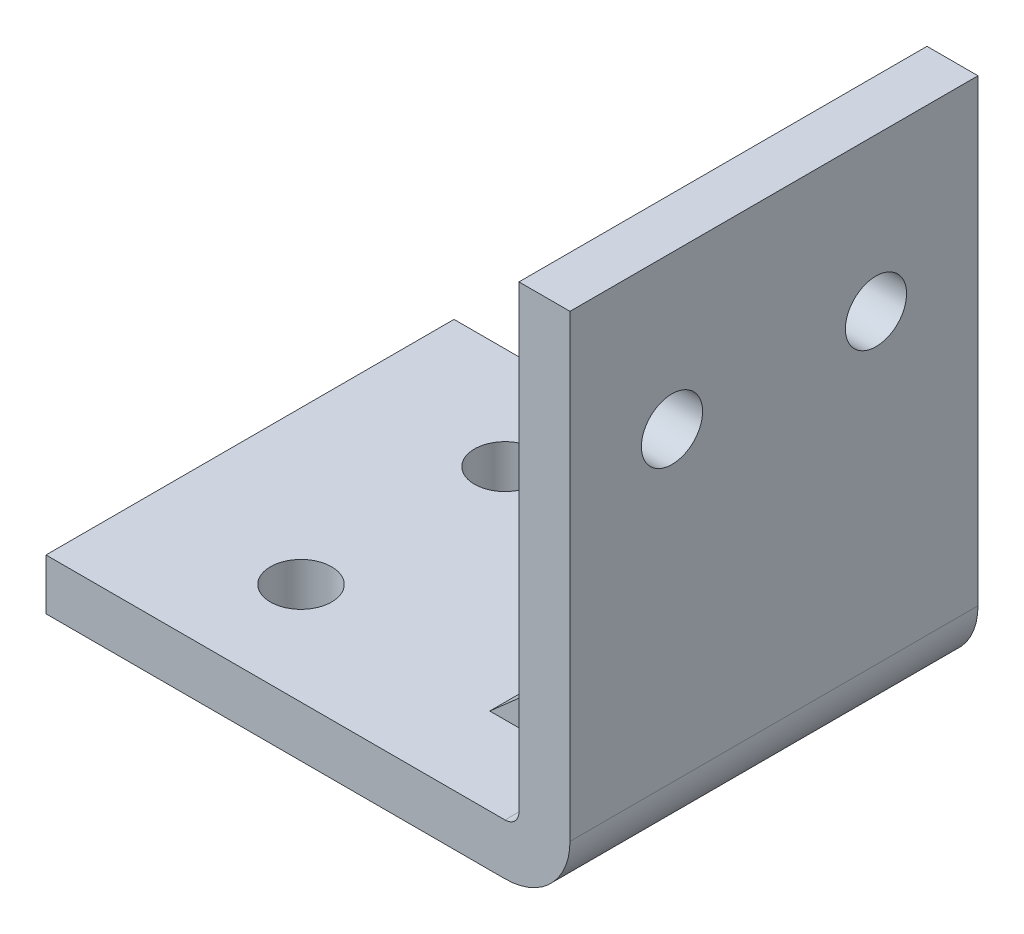
ISO-10303-21;
HEADER;
FILE_DESCRIPTION(('STEP AP214'),'2;1');
FILE_NAME('part.step','',(''),(''),'','','');
FILE_SCHEMA(('AUTOMOTIVE_DESIGN { 1 0 10303 214 1 1 1 1 }'));
ENDSEC;
DATA;
#1=APPLICATION_CONTEXT('core data for automotive mechanical design processes');
#2=APPLICATION_PROTOCOL_DEFINITION('international standard','automotive_design',2000,#1);
#3=PRODUCT_CONTEXT('',#1,'mechanical');
#4=PRODUCT('Part','Part','',(#3));
#5=PRODUCT_RELATED_PRODUCT_CATEGORY('part','',(#4));
#6=PRODUCT_DEFINITION_FORMATION('','',#4);
#7=PRODUCT_DEFINITION_CONTEXT('part definition',#1,'design');
#8=PRODUCT_DEFINITION('design','',#6,#7);
#9=PRODUCT_DEFINITION_SHAPE('','',#8);
#10=(LENGTH_UNIT() NAMED_UNIT(*) SI_UNIT(.MILLI.,.METRE.));
#11=(NAMED_UNIT(*) PLANE_ANGLE_UNIT() SI_UNIT($,.RADIAN.));
#12=(NAMED_UNIT(*) SI_UNIT($,.STERADIAN.) SOLID_ANGLE_UNIT());
#13=UNCERTAINTY_MEASURE_WITH_UNIT(LENGTH_MEASURE(1.E-05),#10,'distance_accuracy_value','');
#14=(GEOMETRIC_REPRESENTATION_CONTEXT(3) GLOBAL_UNCERTAINTY_ASSIGNED_CONTEXT((#13)) GLOBAL_UNIT_ASSIGNED_CONTEXT((#10,
#11,#12)) REPRESENTATION_CONTEXT('',''));
#15=CARTESIAN_POINT('',(0.,0.,0.));
#16=DIRECTION('',(0.,0.,1.));
#17=DIRECTION('',(1.,0.,0.));
#18=AXIS2_PLACEMENT_3D('',#15,#16,#17);
#19=CARTESIAN_POINT('',(-5.,6.3661977236758,20.0000000004366));
#20=DIRECTION('',(0.,0.,-1.));
#21=DIRECTION('',(1.,0.,0.));
#22=AXIS2_PLACEMENT_3D('',#19,#20,#21);
#23=CYLINDRICAL_SURFACE('',#22,1.3661977236758);
#24=CARTESIAN_POINT('',(-5.,6.3661977236758,-8.5));
#25=DIRECTION('',(0.,0.,-1.));
#26=DIRECTION('',(-1.,0.,0.));
#27=AXIS2_PLACEMENT_3D('',#24,#25,#26);
#28=CIRCLE('',#27,1.3661977236758);
#29=CARTESIAN_POINT('',(-5.00000000000003,5.,-8.5));
#30=VERTEX_POINT('',#29);
#31=CARTESIAN_POINT('',(-3.63380227632419,6.3661977236758,-8.5));
#32=VERTEX_POINT('',#31);
#33=EDGE_CURVE('E115',#30,#32,#28,.F.);
#34=ORIENTED_EDGE('',*,*,#33,.F.);
#35=DIRECTION('',(0.,0.,-1.));
#36=VECTOR('',#35,1.);
#37=CARTESIAN_POINT('',(-5.00000000000003,5.,0.));
#38=LINE('',#37,#36);
#39=CARTESIAN_POINT('',(-5.00000000000002,5.,8.5));
#40=VERTEX_POINT('',#39);
#41=EDGE_CURVE('E282',#40,#30,#38,.T.);
#42=ORIENTED_EDGE('',*,*,#41,.F.);
#43=CARTESIAN_POINT('',(-5.,6.3661977236758,8.5));
#44=DIRECTION('',(0.,0.,1.));
#45=DIRECTION('',(1.,0.,0.));
#46=AXIS2_PLACEMENT_3D('',#43,#44,#45);
#47=CIRCLE('',#46,1.3661977236758);
#48=CARTESIAN_POINT('',(-3.63380227632419,6.3661977236758,8.5));
#49=VERTEX_POINT('',#48);
#50=EDGE_CURVE('E249',#49,#40,#47,.F.);
#51=ORIENTED_EDGE('',*,*,#50,.F.);
#52=DIRECTION('',(0.,0.,-1.));
#53=VECTOR('',#52,1.);
#54=CARTESIAN_POINT('',(-3.63380227632419,6.3661977236758,0.));
#55=LINE('',#54,#53);
#56=EDGE_CURVE('E270',#49,#32,#55,.T.);
#57=ORIENTED_EDGE('',*,*,#56,.T.);
#58=EDGE_LOOP('',(#34,#42,#51,#57));
#59=FACE_BOUND('',#58,.T.);
#60=ADVANCED_FACE('F98',(#59),#23,.F.);
#61=CARTESIAN_POINT('',(-5.00000000000003,5.,-11.5));
#62=VERTEX_POINT('',#61);
#63=CARTESIAN_POINT('',(-5.00000000000002,5.,-20.));
#64=VERTEX_POINT('',#63);
#65=EDGE_CURVE('E283',#62,#64,#38,.T.);
#66=ORIENTED_EDGE('',*,*,#65,.F.);
#67=CARTESIAN_POINT('',(-5.,6.3661977236758,-11.5));
#68=DIRECTION('',(0.,0.,-1.));
#69=DIRECTION('',(-1.,0.,0.));
#70=AXIS2_PLACEMENT_3D('',#67,#68,#69);
#71=CIRCLE('',#70,1.3661977236758);
#72=CARTESIAN_POINT('',(-3.63380227632419,6.3661977236758,-11.5));
#73=VERTEX_POINT('',#72);
#74=EDGE_CURVE('E238',#62,#73,#71,.F.);
#75=ORIENTED_EDGE('',*,*,#74,.T.);
#76=CARTESIAN_POINT('',(-3.63380227632419,6.3661977236758,-20.));
#77=VERTEX_POINT('',#76);
#78=EDGE_CURVE('E271',#73,#77,#55,.T.);
#79=ORIENTED_EDGE('',*,*,#78,.T.);
#80=CARTESIAN_POINT('',(-5.,6.3661977236758,-20.));
#81=DIRECTION('',(0.,0.,-1.));
#82=DIRECTION('',(-1.,0.,0.));
#83=AXIS2_PLACEMENT_3D('',#80,#81,#82);
#84=CIRCLE('',#83,1.3661977236758);
#85=EDGE_CURVE('E341',#77,#64,#84,.T.);
#86=ORIENTED_EDGE('',*,*,#85,.T.);
#87=EDGE_LOOP('',(#66,#75,#79,#86));
#88=FACE_BOUND('',#87,.T.);
#89=ADVANCED_FACE('F424',(#88),#23,.F.);
#90=CARTESIAN_POINT('',(1.36619772367586,36.3661977236759,10.));
#91=DIRECTION('',(-1.,0.,0.));
#92=DIRECTION('',(0.,0.,1.));
#93=AXIS2_PLACEMENT_3D('',#90,#91,#92);
#94=CYLINDRICAL_SURFACE('',#93,3.);
#95=CARTESIAN_POINT('',(-3.63380227632414,36.3661977236759,10.));
#96=DIRECTION('',(-1.,0.,0.));
#97=DIRECTION('',(0.,0.,-1.));
#98=AXIS2_PLACEMENT_3D('',#95,#96,#97);
#99=CIRCLE('',#98,3.);
#100=CARTESIAN_POINT('',(-3.63380227632414,36.3661977236759,7.));
#101=VERTEX_POINT('',#100);
#102=EDGE_CURVE('E265',#101,#101,#99,.T.);
#103=ORIENTED_EDGE('',*,*,#102,.T.);
#104=EDGE_LOOP('',(#103));
#105=FACE_BOUND('',#104,.T.);
#106=CARTESIAN_POINT('',(1.36619772367586,36.3661977236759,10.));
#107=DIRECTION('',(-1.,0.,0.));
#108=DIRECTION('',(0.,0.,-1.));
#109=AXIS2_PLACEMENT_3D('',#106,#107,#108);
#110=CIRCLE('',#109,3.);
#111=CARTESIAN_POINT('',(1.36619772367586,36.3661977236759,7.));
#112=VERTEX_POINT('',#111);
#113=EDGE_CURVE('E274',#112,#112,#110,.T.);
#114=ORIENTED_EDGE('',*,*,#113,.F.);
#115=EDGE_LOOP('',(#114));
#116=FACE_BOUND('',#115,.T.);
#117=ADVANCED_FACE('F453',(#105,#116),#94,.F.);
#118=CARTESIAN_POINT('',(-35.,0.,10.));
#119=DIRECTION('',(0.,1.,0.));
#120=DIRECTION('',(0.,0.,1.));
#121=AXIS2_PLACEMENT_3D('',#118,#119,#120);
#122=CYLINDRICAL_SURFACE('',#121,3.);
#123=CARTESIAN_POINT('',(-35.,5.,10.));
#124=DIRECTION('',(0.,-1.,0.));
#125=DIRECTION('',(0.,0.,-1.));
#126=AXIS2_PLACEMENT_3D('',#123,#124,#125);
#127=CIRCLE('',#126,3.);
#128=CARTESIAN_POINT('',(-35.,5.,7.));
#129=VERTEX_POINT('',#128);
#130=EDGE_CURVE('E277',#129,#129,#127,.T.);
#131=ORIENTED_EDGE('',*,*,#130,.F.);
#132=EDGE_LOOP('',(#131));
#133=FACE_BOUND('',#132,.T.);
#134=CARTESIAN_POINT('',(-35.,0.,10.));
#135=DIRECTION('',(0.,-1.,0.));
#136=DIRECTION('',(0.,0.,-1.));
#137=AXIS2_PLACEMENT_3D('',#134,#135,#136);
#138=CIRCLE('',#137,3.);
#139=CARTESIAN_POINT('',(-35.,0.,7.));
#140=VERTEX_POINT('',#139);
#141=EDGE_CURVE('E13',#140,#140,#138,.T.);
#142=ORIENTED_EDGE('',*,*,#141,.T.);
#143=EDGE_LOOP('',(#142));
#144=FACE_BOUND('',#143,.T.);
#145=ADVANCED_FACE('F467',(#133,#144),#122,.F.);
#146=CARTESIAN_POINT('',(1.36619772367586,36.3661977236759,-10.));
#147=DIRECTION('',(-1.,0.,0.));
#148=DIRECTION('',(0.,0.,1.));
#149=AXIS2_PLACEMENT_3D('',#146,#147,#148);
#150=CYLINDRICAL_SURFACE('',#149,3.);
#151=CARTESIAN_POINT('',(-3.63380227632414,36.3661977236759,-10.));
#152=DIRECTION('',(1.,0.,0.));
#153=DIRECTION('',(0.,0.,1.));
#154=AXIS2_PLACEMENT_3D('',#151,#152,#153);
#155=CIRCLE('',#154,3.);
#156=CARTESIAN_POINT('',(-3.63380227632414,36.3661977236759,-7.));
#157=VERTEX_POINT('',#156);
#158=EDGE_CURVE('E311',#157,#157,#155,.T.);
#159=ORIENTED_EDGE('',*,*,#158,.F.);
#160=EDGE_LOOP('',(#159));
#161=FACE_BOUND('',#160,.T.);
#162=CARTESIAN_POINT('',(1.36619772367586,36.3661977236759,-10.));
#163=DIRECTION('',(1.,0.,0.));
#164=DIRECTION('',(0.,0.,1.));
#165=AXIS2_PLACEMENT_3D('',#162,#163,#164);
#166=CIRCLE('',#165,3.);
#167=CARTESIAN_POINT('',(1.36619772367586,36.3661977236759,-7.));
#168=VERTEX_POINT('',#167);
#169=EDGE_CURVE('E107',#168,#168,#166,.T.);
#170=ORIENTED_EDGE('',*,*,#169,.T.);
#171=EDGE_LOOP('',(#170));
#172=FACE_BOUND('',#171,.T.);
#173=ADVANCED_FACE('F462',(#161,#172),#150,.F.);
#174=CARTESIAN_POINT('',(-35.,0.,-10.));
#175=DIRECTION('',(0.,1.,0.));
#176=DIRECTION('',(0.,0.,1.));
#177=AXIS2_PLACEMENT_3D('',#174,#175,#176);
#178=CYLINDRICAL_SURFACE('',#177,3.);
#179=CARTESIAN_POINT('',(-35.,5.,-10.));
#180=DIRECTION('',(0.,1.,0.));
#181=DIRECTION('',(0.,0.,1.));
#182=AXIS2_PLACEMENT_3D('',#179,#180,#181);
#183=CIRCLE('',#182,3.);
#184=CARTESIAN_POINT('',(-35.,5.,-7.));
#185=VERTEX_POINT('',#184);
#186=EDGE_CURVE('E349',#185,#185,#183,.T.);
#187=ORIENTED_EDGE('',*,*,#186,.T.);
#188=EDGE_LOOP('',(#187));
#189=FACE_BOUND('',#188,.T.);
#190=CARTESIAN_POINT('',(-35.,0.,-10.));
#191=DIRECTION('',(0.,1.,0.));
#192=DIRECTION('',(0.,0.,1.));
#193=AXIS2_PLACEMENT_3D('',#190,#191,#192);
#194=CIRCLE('',#193,3.);
#195=CARTESIAN_POINT('',(-35.,0.,-7.));
#196=VERTEX_POINT('',#195);
#197=EDGE_CURVE('E346',#196,#196,#194,.T.);
#198=ORIENTED_EDGE('',*,*,#197,.F.);
#199=EDGE_LOOP('',(#198));
#200=FACE_BOUND('',#199,.T.);
#201=ADVANCED_FACE('F457',(#189,#200),#178,.F.);
#202=CARTESIAN_POINT('',(-3.63380227632419,6.3661977236758,20.));
#203=VERTEX_POINT('',#202);
#204=CARTESIAN_POINT('',(-3.6338022763242,6.3661977236758,11.5));
#205=VERTEX_POINT('',#204);
#206=EDGE_CURVE('E266',#203,#205,#55,.T.);
#207=ORIENTED_EDGE('',*,*,#206,.T.);
#208=CARTESIAN_POINT('',(-5.,6.3661977236758,11.5));
#209=DIRECTION('',(0.,0.,1.));
#210=DIRECTION('',(1.,0.,0.));
#211=AXIS2_PLACEMENT_3D('',#208,#209,#210);
#212=CIRCLE('',#211,1.3661977236758);
#213=CARTESIAN_POINT('',(-5.00000000000002,5.,11.5));
#214=VERTEX_POINT('',#213);
#215=EDGE_CURVE('E256',#205,#214,#212,.F.);
#216=ORIENTED_EDGE('',*,*,#215,.T.);
#217=CARTESIAN_POINT('',(-5.00000000000002,5.,20.));
#218=VERTEX_POINT('',#217);
#219=EDGE_CURVE('E278',#218,#214,#38,.T.);
#220=ORIENTED_EDGE('',*,*,#219,.F.);
#221=CARTESIAN_POINT('',(-5.,6.3661977236758,20.));
#222=DIRECTION('',(0.,0.,-1.));
#223=DIRECTION('',(-1.,0.,0.));
#224=AXIS2_PLACEMENT_3D('',#221,#222,#223);
#225=CIRCLE('',#224,1.3661977236758);
#226=EDGE_CURVE('E269',#218,#203,#225,.F.);
#227=ORIENTED_EDGE('',*,*,#226,.T.);
#228=EDGE_LOOP('',(#207,#216,#220,#227));
#229=FACE_BOUND('',#228,.T.);
#230=ADVANCED_FACE('F407',(#229),#23,.F.);
#231=CARTESIAN_POINT('',(-3.63380227632411,51.3661977236758,20.));
#232=DIRECTION('',(0.,0.,-1.));
#233=DIRECTION('',(0.,-1.,0.));
#234=AXIS2_PLACEMENT_3D('',#231,#232,#233);
#235=PLANE('',#234);
#236=DIRECTION('',(0.,1.,0.));
#237=VECTOR('',#236,1.);
#238=CARTESIAN_POINT('',(-3.63380227632411,51.3661977236758,20.));
#239=LINE('',#238,#237);
#240=CARTESIAN_POINT('',(-3.63380227632411,51.3661977236758,20.));
#241=VERTEX_POINT('',#240);
#242=EDGE_CURVE('E318',#203,#241,#239,.T.);
#243=ORIENTED_EDGE('',*,*,#242,.F.);
#244=ORIENTED_EDGE('',*,*,#226,.F.);
#245=DIRECTION('',(1.,0.,0.));
#246=VECTOR('',#245,1.);
#247=CARTESIAN_POINT('',(50.,5.,20.));
#248=LINE('',#247,#246);
#249=CARTESIAN_POINT('',(-50.,5.,20.));
#250=VERTEX_POINT('',#249);
#251=EDGE_CURVE('E281',#250,#218,#248,.T.);
#252=ORIENTED_EDGE('',*,*,#251,.F.);
#253=DIRECTION('',(0.,-1.,0.));
#254=VECTOR('',#253,1.);
#255=CARTESIAN_POINT('',(-50.,5.,20.));
#256=LINE('',#255,#254);
#257=CARTESIAN_POINT('',(-50.,0.,20.));
#258=VERTEX_POINT('',#257);
#259=EDGE_CURVE('E284',#250,#258,#256,.T.);
#260=ORIENTED_EDGE('',*,*,#259,.T.);
#261=DIRECTION('',(1.,0.,0.));
#262=VECTOR('',#261,1.);
#263=CARTESIAN_POINT('',(50.,0.,20.));
#264=LINE('',#263,#262);
#265=CARTESIAN_POINT('',(-5.00000000000002,0.,20.));
#266=VERTEX_POINT('',#265);
#267=EDGE_CURVE('E288',#258,#266,#264,.T.);
#268=ORIENTED_EDGE('',*,*,#267,.T.);
#269=CARTESIAN_POINT('',(-5.,6.3661977236758,20.));
#270=DIRECTION('',(0.,0.,-1.));
#271=DIRECTION('',(-1.,0.,0.));
#272=AXIS2_PLACEMENT_3D('',#269,#270,#271);
#273=CIRCLE('',#272,6.3661977236758);
#274=CARTESIAN_POINT('',(1.3661977236758,6.36619772367579,20.));
#275=VERTEX_POINT('',#274);
#276=EDGE_CURVE('E102',#266,#275,#273,.F.);
#277=ORIENTED_EDGE('',*,*,#276,.T.);
#278=DIRECTION('',(0.,1.,0.));
#279=VECTOR('',#278,1.);
#280=CARTESIAN_POINT('',(1.36619772367589,51.3661977236758,20.));
#281=LINE('',#280,#279);
#282=CARTESIAN_POINT('',(1.36619772367589,51.3661977236758,20.));
#283=VERTEX_POINT('',#282);
#284=EDGE_CURVE('E332',#275,#283,#281,.T.);
#285=ORIENTED_EDGE('',*,*,#284,.T.);
#286=DIRECTION('',(1.,0.,0.));
#287=VECTOR('',#286,1.);
#288=CARTESIAN_POINT('',(-3.63380227632411,51.3661977236758,20.));
#289=LINE('',#288,#287);
#290=EDGE_CURVE('E291',#241,#283,#289,.T.);
#291=ORIENTED_EDGE('',*,*,#290,.F.);
#292=EDGE_LOOP('',(#243,#244,#252,#260,#268,#277,#285,#291));
#293=FACE_BOUND('',#292,.T.);
#294=ADVANCED_FACE('F389',(#293),#235,.F.);
#295=CARTESIAN_POINT('',(-3.63380227632411,51.3661977236758,-20.));
#296=DIRECTION('',(0.,0.,1.));
#297=DIRECTION('',(0.,1.,0.));
#298=AXIS2_PLACEMENT_3D('',#295,#296,#297);
#299=PLANE('',#298);
#300=DIRECTION('',(0.,-1.,0.));
#301=VECTOR('',#300,1.);
#302=CARTESIAN_POINT('',(1.36619772367589,51.3661977236758,-20.));
#303=LINE('',#302,#301);
#304=CARTESIAN_POINT('',(1.36619772367589,51.3661977236758,-20.));
#305=VERTEX_POINT('',#304);
#306=CARTESIAN_POINT('',(1.36619772367581,6.36619772367579,-20.));
#307=VERTEX_POINT('',#306);
#308=EDGE_CURVE('E299',#305,#307,#303,.T.);
#309=ORIENTED_EDGE('',*,*,#308,.T.);
#310=CARTESIAN_POINT('',(-5.,6.3661977236758,-20.));
#311=DIRECTION('',(0.,0.,-1.));
#312=DIRECTION('',(-1.,0.,0.));
#313=AXIS2_PLACEMENT_3D('',#310,#311,#312);
#314=CIRCLE('',#313,6.3661977236758);
#315=CARTESIAN_POINT('',(-5.00000000000002,0.,-20.));
#316=VERTEX_POINT('',#315);
#317=EDGE_CURVE('E327',#307,#316,#314,.T.);
#318=ORIENTED_EDGE('',*,*,#317,.T.);
#319=DIRECTION('',(-1.,0.,0.));
#320=VECTOR('',#319,1.);
#321=CARTESIAN_POINT('',(50.,0.,-20.));
#322=LINE('',#321,#320);
#323=CARTESIAN_POINT('',(-50.,0.,-20.));
#324=VERTEX_POINT('',#323);
#325=EDGE_CURVE('E294',#316,#324,#322,.T.);
#326=ORIENTED_EDGE('',*,*,#325,.T.);
#327=DIRECTION('',(0.,-1.,0.));
#328=VECTOR('',#327,1.);
#329=CARTESIAN_POINT('',(-50.,5.,-20.));
#330=LINE('',#329,#328);
#331=CARTESIAN_POINT('',(-50.,5.,-20.));
#332=VERTEX_POINT('',#331);
#333=EDGE_CURVE('E287',#332,#324,#330,.T.);
#334=ORIENTED_EDGE('',*,*,#333,.F.);
#335=DIRECTION('',(-1.,0.,0.));
#336=VECTOR('',#335,1.);
#337=CARTESIAN_POINT('',(50.,5.,-20.));
#338=LINE('',#337,#336);
#339=EDGE_CURVE('E312',#64,#332,#338,.T.);
#340=ORIENTED_EDGE('',*,*,#339,.F.);
#341=ORIENTED_EDGE('',*,*,#85,.F.);
#342=DIRECTION('',(0.,-1.,0.));
#343=VECTOR('',#342,1.);
#344=CARTESIAN_POINT('',(-3.63380227632411,51.3661977236758,-20.));
#345=LINE('',#344,#343);
#346=CARTESIAN_POINT('',(-3.63380227632411,51.3661977236758,-20.));
#347=VERTEX_POINT('',#346);
#348=EDGE_CURVE('E307',#347,#77,#345,.T.);
#349=ORIENTED_EDGE('',*,*,#348,.F.);
#350=DIRECTION('',(1.,0.,0.));
#351=VECTOR('',#350,1.);
#352=CARTESIAN_POINT('',(-3.63380227632411,51.3661977236758,-20.));
#353=LINE('',#352,#351);
#354=EDGE_CURVE('E297',#347,#305,#353,.T.);
#355=ORIENTED_EDGE('',*,*,#354,.T.);
#356=EDGE_LOOP('',(#309,#318,#326,#334,#340,#341,#349,#355));
#357=FACE_BOUND('',#356,.T.);
#358=ADVANCED_FACE('F420',(#357),#299,.F.);
#359=CARTESIAN_POINT('',(1.3661977236758,1.36619772367582,0.));
#360=DIRECTION('',(-1.,0.,0.));
#361=DIRECTION('',(0.,0.,1.));
#362=AXIS2_PLACEMENT_3D('',#359,#360,#361);
#363=PLANE('',#362);
#364=DIRECTION('',(0.,0.,-1.));
#365=VECTOR('',#364,1.);
#366=CARTESIAN_POINT('',(1.36619772367581,6.36619772367579,0.));
#367=LINE('',#366,#365);
#368=EDGE_CURVE('E272',#275,#307,#367,.T.);
#369=ORIENTED_EDGE('',*,*,#368,.T.);
#370=ORIENTED_EDGE('',*,*,#308,.F.);
#371=DIRECTION('',(0.,0.,-1.));
#372=VECTOR('',#371,1.);
#373=CARTESIAN_POINT('',(1.36619772367589,51.3661977236758,20.));
#374=LINE('',#373,#372);
#375=EDGE_CURVE('E293',#283,#305,#374,.T.);
#376=ORIENTED_EDGE('',*,*,#375,.F.);
#377=ORIENTED_EDGE('',*,*,#284,.F.);
#378=EDGE_LOOP('',(#369,#370,#376,#377));
#379=FACE_BOUND('',#378,.T.);
#380=ORIENTED_EDGE('',*,*,#169,.F.);
#381=EDGE_LOOP('',(#380));
#382=FACE_BOUND('',#381,.T.);
#383=ORIENTED_EDGE('',*,*,#113,.T.);
#384=EDGE_LOOP('',(#383));
#385=FACE_BOUND('',#384,.T.);
#386=ADVANCED_FACE('F398',(#379,#382,#385),#363,.F.);
#387=CARTESIAN_POINT('',(-5.,6.3661977236758,20.0000000004366));
#388=DIRECTION('',(0.,0.,-1.));
#389=DIRECTION('',(1.,0.,0.));
#390=AXIS2_PLACEMENT_3D('',#387,#388,#389);
#391=CYLINDRICAL_SURFACE('',#390,6.3661977236758);
#392=ORIENTED_EDGE('',*,*,#317,.F.);
#393=ORIENTED_EDGE('',*,*,#368,.F.);
#394=ORIENTED_EDGE('',*,*,#276,.F.);
#395=DIRECTION('',(0.,0.,-1.));
#396=VECTOR('',#395,1.);
#397=CARTESIAN_POINT('',(-5.00000000000003,0.,0.));
#398=LINE('',#397,#396);
#399=EDGE_CURVE('E275',#266,#316,#398,.T.);
#400=ORIENTED_EDGE('',*,*,#399,.T.);
#401=EDGE_LOOP('',(#392,#393,#394,#400));
#402=FACE_BOUND('',#401,.T.);
#403=ADVANCED_FACE('F394',(#402),#391,.T.);
#404=CARTESIAN_POINT('',(0.,5.,0.));
#405=DIRECTION('',(0.,1.,0.));
#406=DIRECTION('',(0.,0.,1.));
#407=AXIS2_PLACEMENT_3D('',#404,#405,#406);
#408=PLANE('',#407);
#409=DIRECTION('',(-1.,0.,0.));
#410=VECTOR('',#409,1.);
#411=CARTESIAN_POINT('',(0.,5.,-11.5));
#412=LINE('',#411,#410);
#413=CARTESIAN_POINT('',(-15.,5.,-11.5));
#414=VERTEX_POINT('',#413);
#415=EDGE_CURVE('E235',#62,#414,#412,.T.);
#416=ORIENTED_EDGE('',*,*,#415,.F.);
#417=ORIENTED_EDGE('',*,*,#65,.T.);
#418=ORIENTED_EDGE('',*,*,#339,.T.);
#419=DIRECTION('',(0.,0.,1.));
#420=VECTOR('',#419,1.);
#421=CARTESIAN_POINT('',(-50.,5.,20.));
#422=LINE('',#421,#420);
#423=EDGE_CURVE('E315',#332,#250,#422,.T.);
#424=ORIENTED_EDGE('',*,*,#423,.T.);
#425=ORIENTED_EDGE('',*,*,#251,.T.);
#426=ORIENTED_EDGE('',*,*,#219,.T.);
#427=DIRECTION('',(1.,0.,0.));
#428=VECTOR('',#427,1.);
#429=CARTESIAN_POINT('',(0.,5.,11.5));
#430=LINE('',#429,#428);
#431=CARTESIAN_POINT('',(-15.,5.,11.5));
#432=VERTEX_POINT('',#431);
#433=EDGE_CURVE('E259',#432,#214,#430,.T.);
#434=ORIENTED_EDGE('',*,*,#433,.F.);
#435=DIRECTION('',(0.,0.,1.));
#436=VECTOR('',#435,1.);
#437=CARTESIAN_POINT('',(-15.,5.,0.));
#438=LINE('',#437,#436);
#439=CARTESIAN_POINT('',(-15.,5.,8.5));
#440=VERTEX_POINT('',#439);
#441=EDGE_CURVE('E263',#440,#432,#438,.T.);
#442=ORIENTED_EDGE('',*,*,#441,.F.);
#443=DIRECTION('',(1.,0.,0.));
#444=VECTOR('',#443,1.);
#445=CARTESIAN_POINT('',(0.,5.,8.5));
#446=LINE('',#445,#444);
#447=EDGE_CURVE('E251',#440,#40,#446,.T.);
#448=ORIENTED_EDGE('',*,*,#447,.T.);
#449=ORIENTED_EDGE('',*,*,#41,.T.);
#450=DIRECTION('',(-1.,0.,0.));
#451=VECTOR('',#450,1.);
#452=CARTESIAN_POINT('',(0.,5.,-8.5));
#453=LINE('',#452,#451);
#454=CARTESIAN_POINT('',(-15.,5.,-8.5));
#455=VERTEX_POINT('',#454);
#456=EDGE_CURVE('E438',#30,#455,#453,.T.);
#457=ORIENTED_EDGE('',*,*,#456,.T.);
#458=DIRECTION('',(0.,0.,-1.));
#459=VECTOR('',#458,1.);
#460=CARTESIAN_POINT('',(-15.,5.,0.));
#461=LINE('',#460,#459);
#462=EDGE_CURVE('E228',#414,#455,#461,.F.);
#463=ORIENTED_EDGE('',*,*,#462,.F.);
#464=EDGE_LOOP('',(#416,#417,#418,#424,#425,#426,#434,#442,#448,#449,#457,#463));
#465=FACE_BOUND('',#464,.T.);
#466=ORIENTED_EDGE('',*,*,#186,.F.);
#467=EDGE_LOOP('',(#466));
#468=FACE_BOUND('',#467,.T.);
#469=ORIENTED_EDGE('',*,*,#130,.T.);
#470=EDGE_LOOP('',(#469));
#471=FACE_BOUND('',#470,.T.);
#472=ADVANCED_FACE('F412',(#465,#468,#471),#408,.T.);
#473=CARTESIAN_POINT('',(-50.,5.,20.));
#474=DIRECTION('',(1.,0.,0.));
#475=DIRECTION('',(0.,0.,-1.));
#476=AXIS2_PLACEMENT_3D('',#473,#474,#475);
#477=PLANE('',#476);
#478=DIRECTION('',(0.,0.,1.));
#479=VECTOR('',#478,1.);
#480=CARTESIAN_POINT('',(-50.,0.,20.));
#481=LINE('',#480,#479);
#482=EDGE_CURVE('E304',#324,#258,#481,.T.);
#483=ORIENTED_EDGE('',*,*,#482,.T.);
#484=ORIENTED_EDGE('',*,*,#259,.F.);
#485=ORIENTED_EDGE('',*,*,#423,.F.);
#486=ORIENTED_EDGE('',*,*,#333,.T.);
#487=EDGE_LOOP('',(#483,#484,#485,#486));
#488=FACE_BOUND('',#487,.T.);
#489=ADVANCED_FACE('F416',(#488),#477,.F.);
#490=CARTESIAN_POINT('',(-3.63380227632411,51.3661977236758,20.));
#491=DIRECTION('',(0.,-1.,0.));
#492=DIRECTION('',(0.,0.,1.));
#493=AXIS2_PLACEMENT_3D('',#490,#491,#492);
#494=PLANE('',#493);
#495=ORIENTED_EDGE('',*,*,#375,.T.);
#496=ORIENTED_EDGE('',*,*,#354,.F.);
#497=DIRECTION('',(0.,0.,-1.));
#498=VECTOR('',#497,1.);
#499=CARTESIAN_POINT('',(-3.63380227632411,51.3661977236758,20.));
#500=LINE('',#499,#498);
#501=EDGE_CURVE('E310',#241,#347,#500,.T.);
#502=ORIENTED_EDGE('',*,*,#501,.F.);
#503=ORIENTED_EDGE('',*,*,#290,.T.);
#504=EDGE_LOOP('',(#495,#496,#502,#503));
#505=FACE_BOUND('',#504,.T.);
#506=ADVANCED_FACE('F402',(#505),#494,.F.);
#507=CARTESIAN_POINT('',(-3.6338022763242,1.36619772367583,0.));
#508=DIRECTION('',(-1.,0.,0.));
#509=DIRECTION('',(0.,0.,1.));
#510=AXIS2_PLACEMENT_3D('',#507,#508,#509);
#511=PLANE('',#510);
#512=DIRECTION('',(0.,-1.,0.));
#513=VECTOR('',#512,1.);
#514=CARTESIAN_POINT('',(-3.6338022763242,1.36619772367583,-11.5));
#515=LINE('',#514,#513);
#516=CARTESIAN_POINT('',(-3.63380227632418,15.,-11.5));
#517=VERTEX_POINT('',#516);
#518=EDGE_CURVE('E234',#517,#73,#515,.T.);
#519=ORIENTED_EDGE('',*,*,#518,.F.);
#520=DIRECTION('',(0.,0.,1.));
#521=VECTOR('',#520,1.);
#522=CARTESIAN_POINT('',(-3.63380227632418,15.,0.));
#523=LINE('',#522,#521);
#524=CARTESIAN_POINT('',(-3.63380227632418,15.,-8.5));
#525=VERTEX_POINT('',#524);
#526=EDGE_CURVE('E225',#525,#517,#523,.F.);
#527=ORIENTED_EDGE('',*,*,#526,.F.);
#528=DIRECTION('',(0.,-1.,0.));
#529=VECTOR('',#528,1.);
#530=CARTESIAN_POINT('',(-3.6338022763242,1.36619772367583,-8.5));
#531=LINE('',#530,#529);
#532=EDGE_CURVE('E211',#525,#32,#531,.T.);
#533=ORIENTED_EDGE('',*,*,#532,.T.);
#534=ORIENTED_EDGE('',*,*,#56,.F.);
#535=DIRECTION('',(0.,1.,0.));
#536=VECTOR('',#535,1.);
#537=CARTESIAN_POINT('',(-3.6338022763242,1.36619772367583,8.5));
#538=LINE('',#537,#536);
#539=CARTESIAN_POINT('',(-3.63380227632418,15.,8.5));
#540=VERTEX_POINT('',#539);
#541=EDGE_CURVE('E245',#49,#540,#538,.T.);
#542=ORIENTED_EDGE('',*,*,#541,.T.);
#543=DIRECTION('',(0.,0.,-1.));
#544=VECTOR('',#543,1.);
#545=CARTESIAN_POINT('',(-3.63380227632418,15.,0.));
#546=LINE('',#545,#544);
#547=CARTESIAN_POINT('',(-3.63380227632418,15.,11.5));
#548=VERTEX_POINT('',#547);
#549=EDGE_CURVE('E261',#548,#540,#546,.T.);
#550=ORIENTED_EDGE('',*,*,#549,.F.);
#551=DIRECTION('',(0.,1.,0.));
#552=VECTOR('',#551,1.);
#553=CARTESIAN_POINT('',(-3.6338022763242,1.36619772367583,11.5));
#554=LINE('',#553,#552);
#555=EDGE_CURVE('E254',#205,#548,#554,.T.);
#556=ORIENTED_EDGE('',*,*,#555,.F.);
#557=ORIENTED_EDGE('',*,*,#206,.F.);
#558=ORIENTED_EDGE('',*,*,#242,.T.);
#559=ORIENTED_EDGE('',*,*,#501,.T.);
#560=ORIENTED_EDGE('',*,*,#348,.T.);
#561=ORIENTED_EDGE('',*,*,#78,.F.);
#562=EDGE_LOOP('',(#519,#527,#533,#534,#542,#550,#556,#557,#558,#559,#560,#561));
#563=FACE_BOUND('',#562,.T.);
#564=ORIENTED_EDGE('',*,*,#102,.F.);
#565=EDGE_LOOP('',(#564));
#566=FACE_BOUND('',#565,.T.);
#567=ORIENTED_EDGE('',*,*,#158,.T.);
#568=EDGE_LOOP('',(#567));
#569=FACE_BOUND('',#568,.T.);
#570=ADVANCED_FACE('F231',(#563,#566,#569),#511,.T.);
#571=CARTESIAN_POINT('',(0.,0.,0.));
#572=DIRECTION('',(0.,1.,0.));
#573=DIRECTION('',(0.,0.,1.));
#574=AXIS2_PLACEMENT_3D('',#571,#572,#573);
#575=PLANE('',#574);
#576=ORIENTED_EDGE('',*,*,#325,.F.);
#577=ORIENTED_EDGE('',*,*,#399,.F.);
#578=ORIENTED_EDGE('',*,*,#267,.F.);
#579=ORIENTED_EDGE('',*,*,#482,.F.);
#580=EDGE_LOOP('',(#576,#577,#578,#579));
#581=FACE_BOUND('',#580,.T.);
#582=ORIENTED_EDGE('',*,*,#141,.F.);
#583=EDGE_LOOP('',(#582));
#584=FACE_BOUND('',#583,.T.);
#585=ORIENTED_EDGE('',*,*,#197,.T.);
#586=EDGE_LOOP('',(#585));
#587=FACE_BOUND('',#586,.T.);
#588=ADVANCED_FACE('F100',(#581,#584,#587),#575,.F.);
#589=CARTESIAN_POINT('',(-3.63380227632418,15.,10.));
#590=DIRECTION('',(-0.660543982737633,0.750787351298026,0.));
#591=DIRECTION('',(-0.750787351298026,-0.660543982737633,0.));
#592=AXIS2_PLACEMENT_3D('',#589,#590,#591);
#593=PLANE('',#592);
#594=DIRECTION('',(-0.750787351298026,-0.660543982737633,0.));
#595=VECTOR('',#594,1.);
#596=CARTESIAN_POINT('',(-3.63380227632418,15.,8.5));
#597=LINE('',#596,#595);
#598=EDGE_CURVE('E123',#540,#440,#597,.T.);
#599=ORIENTED_EDGE('',*,*,#598,.T.);
#600=ORIENTED_EDGE('',*,*,#441,.T.);
#601=DIRECTION('',(-0.750787351298026,-0.660543982737633,0.));
#602=VECTOR('',#601,1.);
#603=CARTESIAN_POINT('',(-3.63380227632418,15.,11.5));
#604=LINE('',#603,#602);
#605=EDGE_CURVE('E242',#548,#432,#604,.T.);
#606=ORIENTED_EDGE('',*,*,#605,.F.);
#607=ORIENTED_EDGE('',*,*,#549,.T.);
#608=EDGE_LOOP('',(#599,#600,#606,#607));
#609=FACE_BOUND('',#608,.T.);
#610=ADVANCED_FACE('F478',(#609),#593,.T.);
#611=CARTESIAN_POINT('',(-24.3169011381621,25.6830988618379,11.5));
#612=DIRECTION('',(0.,0.,1.));
#613=DIRECTION('',(1.,0.,0.));
#614=AXIS2_PLACEMENT_3D('',#611,#612,#613);
#615=PLANE('',#614);
#616=ORIENTED_EDGE('',*,*,#605,.T.);
#617=ORIENTED_EDGE('',*,*,#433,.T.);
#618=ORIENTED_EDGE('',*,*,#215,.F.);
#619=ORIENTED_EDGE('',*,*,#555,.T.);
#620=EDGE_LOOP('',(#616,#617,#618,#619));
#621=FACE_BOUND('',#620,.T.);
#622=ADVANCED_FACE('F481',(#621),#615,.T.);
#623=CARTESIAN_POINT('',(-24.3169011381621,25.6830988618379,8.5));
#624=DIRECTION('',(0.,0.,1.));
#625=DIRECTION('',(1.,0.,0.));
#626=AXIS2_PLACEMENT_3D('',#623,#624,#625);
#627=PLANE('',#626);
#628=ORIENTED_EDGE('',*,*,#447,.F.);
#629=ORIENTED_EDGE('',*,*,#598,.F.);
#630=ORIENTED_EDGE('',*,*,#541,.F.);
#631=ORIENTED_EDGE('',*,*,#50,.T.);
#632=EDGE_LOOP('',(#628,#629,#630,#631));
#633=FACE_BOUND('',#632,.T.);
#634=ADVANCED_FACE('F430',(#633),#627,.F.);
#635=CARTESIAN_POINT('',(-3.63380227632418,15.,-10.));
#636=DIRECTION('',(0.660543982737633,-0.750787351298026,0.));
#637=DIRECTION('',(-0.750787351298026,-0.660543982737633,0.));
#638=AXIS2_PLACEMENT_3D('',#635,#636,#637);
#639=PLANE('',#638);
#640=DIRECTION('',(-0.750787351298026,-0.660543982737633,0.));
#641=VECTOR('',#640,1.);
#642=CARTESIAN_POINT('',(-3.63380227632418,15.,-11.5));
#643=LINE('',#642,#641);
#644=EDGE_CURVE('E220',#517,#414,#643,.T.);
#645=ORIENTED_EDGE('',*,*,#644,.T.);
#646=ORIENTED_EDGE('',*,*,#462,.T.);
#647=DIRECTION('',(-0.750787351298026,-0.660543982737633,0.));
#648=VECTOR('',#647,1.);
#649=CARTESIAN_POINT('',(-3.63380227632418,15.,-8.5));
#650=LINE('',#649,#648);
#651=EDGE_CURVE('E214',#525,#455,#650,.T.);
#652=ORIENTED_EDGE('',*,*,#651,.F.);
#653=ORIENTED_EDGE('',*,*,#526,.T.);
#654=EDGE_LOOP('',(#645,#646,#652,#653));
#655=FACE_BOUND('',#654,.T.);
#656=ADVANCED_FACE('F224',(#655),#639,.F.);
#657=CARTESIAN_POINT('',(-24.3169011381621,25.6830988618379,-11.5));
#658=DIRECTION('',(0.,0.,-1.));
#659=DIRECTION('',(-1.,0.,0.));
#660=AXIS2_PLACEMENT_3D('',#657,#658,#659);
#661=PLANE('',#660);
#662=ORIENTED_EDGE('',*,*,#74,.F.);
#663=ORIENTED_EDGE('',*,*,#415,.T.);
#664=ORIENTED_EDGE('',*,*,#644,.F.);
#665=ORIENTED_EDGE('',*,*,#518,.T.);
#666=EDGE_LOOP('',(#662,#663,#664,#665));
#667=FACE_BOUND('',#666,.T.);
#668=ADVANCED_FACE('F434',(#667),#661,.T.);
#669=CARTESIAN_POINT('',(-24.3169011381621,25.6830988618379,-8.5));
#670=DIRECTION('',(0.,0.,-1.));
#671=DIRECTION('',(-1.,0.,0.));
#672=AXIS2_PLACEMENT_3D('',#669,#670,#671);
#673=PLANE('',#672);
#674=ORIENTED_EDGE('',*,*,#456,.F.);
#675=ORIENTED_EDGE('',*,*,#33,.T.);
#676=ORIENTED_EDGE('',*,*,#532,.F.);
#677=ORIENTED_EDGE('',*,*,#651,.T.);
#678=EDGE_LOOP('',(#674,#675,#676,#677));
#679=FACE_BOUND('',#678,.T.);
#680=ADVANCED_FACE('F213',(#679),#673,.F.);
#681=CLOSED_SHELL('',(#60,#89,#117,#145,#173,#201,#230,#294,#358,#386,#403,#472,#489,#506,#570,
#588,#610,#622,#634,#656,#668,#680));
#682=MANIFOLD_SOLID_BREP('B2',#681);
#683=ADVANCED_BREP_SHAPE_REPRESENTATION('',(#18,#682),#14);
#684=SHAPE_DEFINITION_REPRESENTATION(#9,#683);
ENDSEC;
END-ISO-10303-21;
